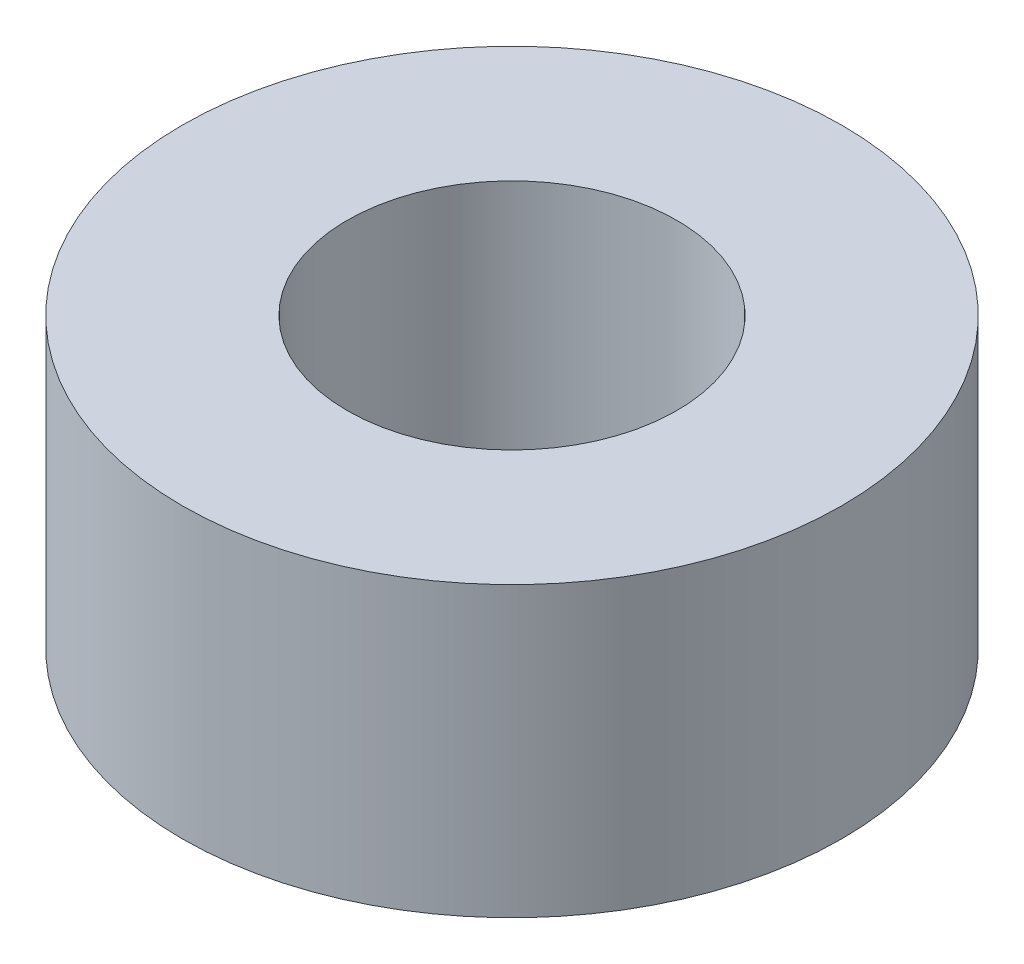
ISO-10303-21;
HEADER;
FILE_DESCRIPTION(('STEP AP214'),'2;1');
FILE_NAME('part.step','',(''),(''),'','','');
FILE_SCHEMA(('AUTOMOTIVE_DESIGN { 1 0 10303 214 1 1 1 1 }'));
ENDSEC;
DATA;
#1=APPLICATION_CONTEXT('core data for automotive mechanical design processes');
#2=APPLICATION_PROTOCOL_DEFINITION('international standard','automotive_design',2000,#1);
#3=PRODUCT_CONTEXT('',#1,'mechanical');
#4=PRODUCT('Part','Part','',(#3));
#5=PRODUCT_RELATED_PRODUCT_CATEGORY('part','',(#4));
#6=PRODUCT_DEFINITION_FORMATION('','',#4);
#7=PRODUCT_DEFINITION_CONTEXT('part definition',#1,'design');
#8=PRODUCT_DEFINITION('design','',#6,#7);
#9=PRODUCT_DEFINITION_SHAPE('','',#8);
#10=(LENGTH_UNIT() NAMED_UNIT(*) SI_UNIT(.MILLI.,.METRE.));
#11=(NAMED_UNIT(*) PLANE_ANGLE_UNIT() SI_UNIT($,.RADIAN.));
#12=(NAMED_UNIT(*) SI_UNIT($,.STERADIAN.) SOLID_ANGLE_UNIT());
#13=UNCERTAINTY_MEASURE_WITH_UNIT(LENGTH_MEASURE(1.E-05),#10,'distance_accuracy_value','');
#14=(GEOMETRIC_REPRESENTATION_CONTEXT(3) GLOBAL_UNCERTAINTY_ASSIGNED_CONTEXT((#13)) GLOBAL_UNIT_ASSIGNED_CONTEXT((#10,
#11,#12)) REPRESENTATION_CONTEXT('',''));
#15=CARTESIAN_POINT('',(0.,0.,0.));
#16=DIRECTION('',(0.,0.,1.));
#17=DIRECTION('',(1.,0.,0.));
#18=AXIS2_PLACEMENT_3D('',#15,#16,#17);
#19=CARTESIAN_POINT('',(0.,3.5,0.));
#20=DIRECTION('',(0.,1.,0.));
#21=DIRECTION('',(0.,0.,1.));
#22=AXIS2_PLACEMENT_3D('',#19,#20,#21);
#23=PLANE('',#22);
#24=CARTESIAN_POINT('',(0.,3.5,0.));
#25=DIRECTION('',(0.,1.,0.));
#26=DIRECTION('',(0.,0.,1.));
#27=AXIS2_PLACEMENT_3D('',#24,#25,#26);
#28=CIRCLE('',#27,4.);
#29=CARTESIAN_POINT('',(0.,3.5,4.));
#30=VERTEX_POINT('',#29);
#31=EDGE_CURVE('E10',#30,#30,#28,.T.);
#32=ORIENTED_EDGE('',*,*,#31,.T.);
#33=EDGE_LOOP('',(#32));
#34=FACE_BOUND('',#33,.T.);
#35=CARTESIAN_POINT('',(0.,3.5,0.));
#36=DIRECTION('',(0.,1.,0.));
#37=DIRECTION('',(0.,0.,1.));
#38=AXIS2_PLACEMENT_3D('',#35,#36,#37);
#39=CIRCLE('',#38,2.);
#40=CARTESIAN_POINT('',(0.,3.5,2.));
#41=VERTEX_POINT('',#40);
#42=EDGE_CURVE('E54',#41,#41,#39,.T.);
#43=ORIENTED_EDGE('',*,*,#42,.F.);
#44=EDGE_LOOP('',(#43));
#45=FACE_BOUND('',#44,.T.);
#46=ADVANCED_FACE('F41',(#34,#45),#23,.T.);
#47=CARTESIAN_POINT('',(0.,0.,0.));
#48=DIRECTION('',(0.,1.,0.));
#49=DIRECTION('',(0.,0.,1.));
#50=AXIS2_PLACEMENT_3D('',#47,#48,#49);
#51=PLANE('',#50);
#52=CARTESIAN_POINT('',(0.,0.,0.));
#53=DIRECTION('',(0.,1.,0.));
#54=DIRECTION('',(0.,0.,1.));
#55=AXIS2_PLACEMENT_3D('',#52,#53,#54);
#56=CIRCLE('',#55,4.);
#57=CARTESIAN_POINT('',(0.,0.,4.));
#58=VERTEX_POINT('',#57);
#59=EDGE_CURVE('E45',#58,#58,#56,.T.);
#60=ORIENTED_EDGE('',*,*,#59,.F.);
#61=EDGE_LOOP('',(#60));
#62=FACE_BOUND('',#61,.T.);
#63=CARTESIAN_POINT('',(0.,0.,0.));
#64=DIRECTION('',(0.,1.,0.));
#65=DIRECTION('',(0.,0.,1.));
#66=AXIS2_PLACEMENT_3D('',#63,#64,#65);
#67=CIRCLE('',#66,2.);
#68=CARTESIAN_POINT('',(0.,0.,2.));
#69=VERTEX_POINT('',#68);
#70=EDGE_CURVE('E56',#69,#69,#67,.T.);
#71=ORIENTED_EDGE('',*,*,#70,.T.);
#72=EDGE_LOOP('',(#71));
#73=FACE_BOUND('',#72,.T.);
#74=ADVANCED_FACE('F68',(#62,#73),#51,.F.);
#75=CARTESIAN_POINT('',(0.,3.5,0.));
#76=DIRECTION('',(0.,-1.,0.));
#77=DIRECTION('',(0.,0.,-1.));
#78=AXIS2_PLACEMENT_3D('',#75,#76,#77);
#79=CYLINDRICAL_SURFACE('',#78,4.);
#80=ORIENTED_EDGE('',*,*,#31,.F.);
#81=EDGE_LOOP('',(#80));
#82=FACE_BOUND('',#81,.T.);
#83=ORIENTED_EDGE('',*,*,#59,.T.);
#84=EDGE_LOOP('',(#83));
#85=FACE_BOUND('',#84,.T.);
#86=ADVANCED_FACE('F43',(#82,#85),#79,.T.);
#87=CARTESIAN_POINT('',(0.,3.5,0.));
#88=DIRECTION('',(0.,-1.,0.));
#89=DIRECTION('',(0.,0.,-1.));
#90=AXIS2_PLACEMENT_3D('',#87,#88,#89);
#91=CYLINDRICAL_SURFACE('',#90,2.);
#92=ORIENTED_EDGE('',*,*,#42,.T.);
#93=EDGE_LOOP('',(#92));
#94=FACE_BOUND('',#93,.T.);
#95=ORIENTED_EDGE('',*,*,#70,.F.);
#96=EDGE_LOOP('',(#95));
#97=FACE_BOUND('',#96,.T.);
#98=ADVANCED_FACE('F64',(#94,#97),#91,.F.);
#99=CLOSED_SHELL('',(#46,#74,#86,#98));
#100=MANIFOLD_SOLID_BREP('B2',#99);
#101=ADVANCED_BREP_SHAPE_REPRESENTATION('',(#18,#100),#14);
#102=SHAPE_DEFINITION_REPRESENTATION(#9,#101);
ENDSEC;
END-ISO-10303-21;
